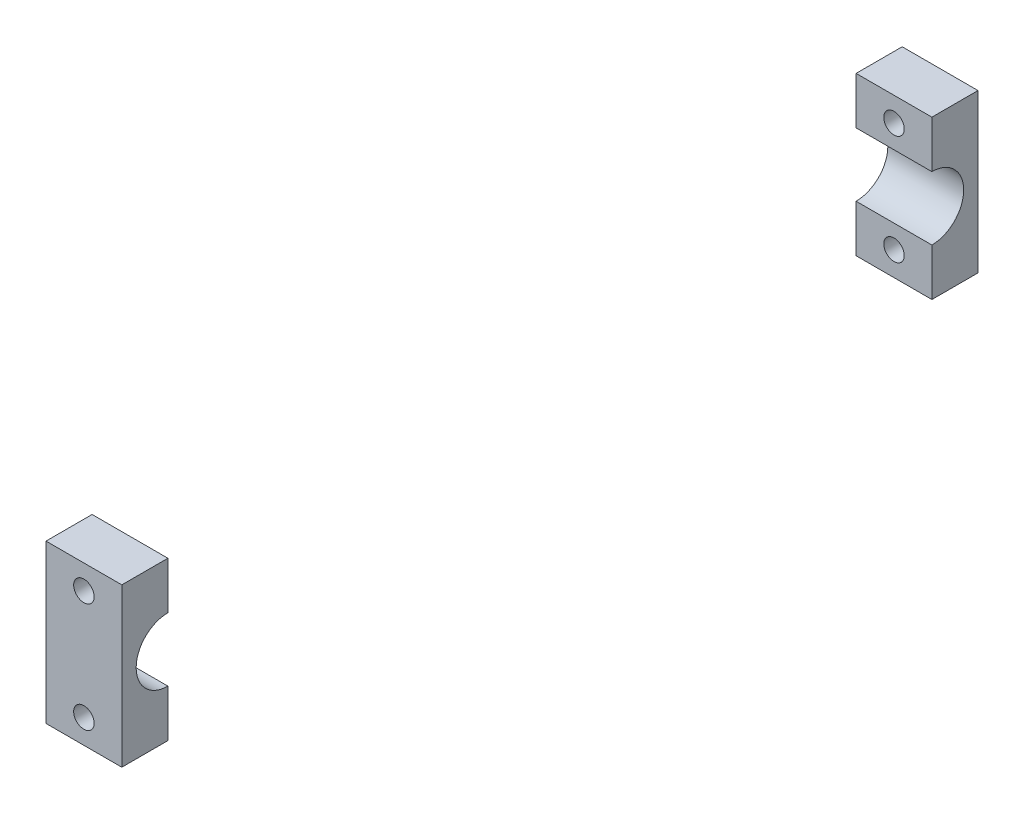
ISO-10303-21;
HEADER;
FILE_DESCRIPTION(('STEP AP214'),'2;1');
FILE_NAME('part.step','',(''),(''),'','','');
FILE_SCHEMA(('AUTOMOTIVE_DESIGN { 1 0 10303 214 1 1 1 1 }'));
ENDSEC;
DATA;
#1=APPLICATION_CONTEXT('core data for automotive mechanical design processes');
#2=APPLICATION_PROTOCOL_DEFINITION('international standard','automotive_design',2000,#1);
#3=PRODUCT_CONTEXT('',#1,'mechanical');
#4=PRODUCT('Part','Part','',(#3));
#5=PRODUCT_RELATED_PRODUCT_CATEGORY('part','',(#4));
#6=PRODUCT_DEFINITION_FORMATION('','',#4);
#7=PRODUCT_DEFINITION_CONTEXT('part definition',#1,'design');
#8=PRODUCT_DEFINITION('design','',#6,#7);
#9=PRODUCT_DEFINITION_SHAPE('','',#8);
#10=(LENGTH_UNIT() NAMED_UNIT(*) SI_UNIT(.MILLI.,.METRE.));
#11=(NAMED_UNIT(*) PLANE_ANGLE_UNIT() SI_UNIT($,.RADIAN.));
#12=(NAMED_UNIT(*) SI_UNIT($,.STERADIAN.) SOLID_ANGLE_UNIT());
#13=UNCERTAINTY_MEASURE_WITH_UNIT(LENGTH_MEASURE(1.E-05),#10,'distance_accuracy_value','');
#14=(GEOMETRIC_REPRESENTATION_CONTEXT(3) GLOBAL_UNCERTAINTY_ASSIGNED_CONTEXT((#13)) GLOBAL_UNIT_ASSIGNED_CONTEXT((#10,
#11,#12)) REPRESENTATION_CONTEXT('',''));
#15=CARTESIAN_POINT('',(0.,0.,0.));
#16=DIRECTION('',(0.,0.,1.));
#17=DIRECTION('',(1.,0.,0.));
#18=AXIS2_PLACEMENT_3D('',#15,#16,#17);
#19=CARTESIAN_POINT('',(14.8,0.,0.));
#20=DIRECTION('',(-1.,0.,0.));
#21=DIRECTION('',(0.,0.,1.));
#22=AXIS2_PLACEMENT_3D('',#19,#20,#21);
#23=PLANE('',#22);
#24=DIRECTION('',(0.,1.,0.));
#25=VECTOR('',#24,1.);
#26=CARTESIAN_POINT('',(14.8,-4.5,-83.579));
#27=LINE('',#26,#25);
#28=CARTESIAN_POINT('',(14.8,-54.92,-83.579));
#29=VERTEX_POINT('',#28);
#30=CARTESIAN_POINT('',(14.8,-24.08,-83.579));
#31=VERTEX_POINT('',#30);
#32=EDGE_CURVE('E144',#29,#31,#27,.T.);
#33=ORIENTED_EDGE('',*,*,#32,.T.);
#34=DIRECTION('',(0.,0.,1.));
#35=VECTOR('',#34,1.);
#36=CARTESIAN_POINT('',(14.8,-24.08,74.579));
#37=LINE('',#36,#35);
#38=CARTESIAN_POINT('',(14.8,-24.08,-74.579));
#39=VERTEX_POINT('',#38);
#40=EDGE_CURVE('E62',#31,#39,#37,.T.);
#41=ORIENTED_EDGE('',*,*,#40,.T.);
#42=DIRECTION('',(0.,-1.,0.));
#43=VECTOR('',#42,1.);
#44=CARTESIAN_POINT('',(14.8,-33.3,-74.579));
#45=LINE('',#44,#43);
#46=CARTESIAN_POINT('',(14.8,-33.3,-74.579));
#47=VERTEX_POINT('',#46);
#48=EDGE_CURVE('E124',#39,#47,#45,.T.);
#49=ORIENTED_EDGE('',*,*,#48,.T.);
#50=CARTESIAN_POINT('',(14.8,-39.5,-74.579));
#51=DIRECTION('',(-1.,0.,0.));
#52=DIRECTION('',(0.,0.,-1.));
#53=AXIS2_PLACEMENT_3D('',#50,#51,#52);
#54=CIRCLE('',#53,6.2);
#55=CARTESIAN_POINT('',(14.8,-45.7,-74.579));
#56=VERTEX_POINT('',#55);
#57=EDGE_CURVE('E147',#47,#56,#54,.T.);
#58=ORIENTED_EDGE('',*,*,#57,.T.);
#59=DIRECTION('',(0.,-1.,0.));
#60=VECTOR('',#59,1.);
#61=CARTESIAN_POINT('',(14.8,-54.92,-74.579));
#62=LINE('',#61,#60);
#63=CARTESIAN_POINT('',(14.8,-54.92,-74.579));
#64=VERTEX_POINT('',#63);
#65=EDGE_CURVE('E120',#56,#64,#62,.T.);
#66=ORIENTED_EDGE('',*,*,#65,.T.);
#67=DIRECTION('',(0.,0.,-1.));
#68=VECTOR('',#67,1.);
#69=CARTESIAN_POINT('',(14.8,-54.92,-83.579));
#70=LINE('',#69,#68);
#71=EDGE_CURVE('E114',#64,#29,#70,.T.);
#72=ORIENTED_EDGE('',*,*,#71,.T.);
#73=EDGE_LOOP('',(#33,#41,#49,#58,#66,#72));
#74=FACE_BOUND('',#73,.T.);
#75=ADVANCED_FACE('F46',(#74),#23,.F.);
#76=CARTESIAN_POINT('',(0.,0.,0.));
#77=DIRECTION('',(-1.,0.,0.));
#78=DIRECTION('',(0.,0.,1.));
#79=AXIS2_PLACEMENT_3D('',#76,#77,#78);
#80=PLANE('',#79);
#81=DIRECTION('',(0.,0.,1.));
#82=VECTOR('',#81,1.);
#83=CARTESIAN_POINT('',(0.,-24.08,74.579));
#84=LINE('',#83,#82);
#85=CARTESIAN_POINT('',(0.,-24.08,-83.5789999999999));
#86=VERTEX_POINT('',#85);
#87=CARTESIAN_POINT('',(0.,-24.08,-74.579));
#88=VERTEX_POINT('',#87);
#89=EDGE_CURVE('E50',#86,#88,#84,.T.);
#90=ORIENTED_EDGE('',*,*,#89,.F.);
#91=DIRECTION('',(0.,1.,0.));
#92=VECTOR('',#91,1.);
#93=CARTESIAN_POINT('',(0.,-39.5,-83.579));
#94=LINE('',#93,#92);
#95=CARTESIAN_POINT('',(0.,-54.92,-83.579));
#96=VERTEX_POINT('',#95);
#97=EDGE_CURVE('E105',#96,#86,#94,.T.);
#98=ORIENTED_EDGE('',*,*,#97,.F.);
#99=DIRECTION('',(0.,0.,-1.));
#100=VECTOR('',#99,1.);
#101=CARTESIAN_POINT('',(0.,-54.92,-83.579));
#102=LINE('',#101,#100);
#103=CARTESIAN_POINT('',(0.,-54.92,-74.579));
#104=VERTEX_POINT('',#103);
#105=EDGE_CURVE('E126',#104,#96,#102,.T.);
#106=ORIENTED_EDGE('',*,*,#105,.F.);
#107=DIRECTION('',(0.,-1.,0.));
#108=VECTOR('',#107,1.);
#109=CARTESIAN_POINT('',(0.,-54.92,-74.579));
#110=LINE('',#109,#108);
#111=CARTESIAN_POINT('',(0.,-45.7,-74.579));
#112=VERTEX_POINT('',#111);
#113=EDGE_CURVE('E128',#112,#104,#110,.T.);
#114=ORIENTED_EDGE('',*,*,#113,.F.);
#115=CARTESIAN_POINT('',(0.,-39.5,-74.579));
#116=DIRECTION('',(-1.,0.,0.));
#117=DIRECTION('',(0.,0.,-1.));
#118=AXIS2_PLACEMENT_3D('',#115,#116,#117);
#119=CIRCLE('',#118,6.2);
#120=CARTESIAN_POINT('',(0.,-33.3,-74.579));
#121=VERTEX_POINT('',#120);
#122=EDGE_CURVE('E133',#121,#112,#119,.T.);
#123=ORIENTED_EDGE('',*,*,#122,.F.);
#124=DIRECTION('',(0.,-1.,0.));
#125=VECTOR('',#124,1.);
#126=CARTESIAN_POINT('',(0.,-33.3,-74.579));
#127=LINE('',#126,#125);
#128=EDGE_CURVE('E108',#88,#121,#127,.T.);
#129=ORIENTED_EDGE('',*,*,#128,.F.);
#130=EDGE_LOOP('',(#90,#98,#106,#114,#123,#129));
#131=FACE_BOUND('',#130,.T.);
#132=ADVANCED_FACE('F103',(#131),#80,.T.);
#133=CARTESIAN_POINT('',(0.,-4.5,-83.579));
#134=DIRECTION('',(0.,0.,-1.));
#135=DIRECTION('',(0.,1.,0.));
#136=AXIS2_PLACEMENT_3D('',#133,#134,#135);
#137=PLANE('',#136);
#138=DIRECTION('',(-1.,0.,0.));
#139=VECTOR('',#138,1.);
#140=CARTESIAN_POINT('',(0.,-24.08,-83.579));
#141=LINE('',#140,#139);
#142=EDGE_CURVE('E94',#31,#86,#141,.T.);
#143=ORIENTED_EDGE('',*,*,#142,.F.);
#144=ORIENTED_EDGE('',*,*,#32,.F.);
#145=DIRECTION('',(1.,0.,0.));
#146=VECTOR('',#145,1.);
#147=CARTESIAN_POINT('',(0.,-54.92,-83.579));
#148=LINE('',#147,#146);
#149=EDGE_CURVE('E112',#96,#29,#148,.T.);
#150=ORIENTED_EDGE('',*,*,#149,.F.);
#151=ORIENTED_EDGE('',*,*,#97,.T.);
#152=EDGE_LOOP('',(#143,#144,#150,#151));
#153=FACE_BOUND('',#152,.T.);
#154=CARTESIAN_POINT('',(7.4,-28.8,-83.579));
#155=DIRECTION('',(0.,0.,-1.));
#156=DIRECTION('',(0.,1.,0.));
#157=AXIS2_PLACEMENT_3D('',#154,#155,#156);
#158=CIRCLE('',#157,2.);
#159=CARTESIAN_POINT('',(7.4,-26.8,-83.579));
#160=VERTEX_POINT('',#159);
#161=EDGE_CURVE('E113',#160,#160,#158,.F.);
#162=ORIENTED_EDGE('',*,*,#161,.T.);
#163=EDGE_LOOP('',(#162));
#164=FACE_BOUND('',#163,.T.);
#165=CARTESIAN_POINT('',(7.4,-50.2,-83.579));
#166=DIRECTION('',(0.,0.,-1.));
#167=DIRECTION('',(0.,1.,0.));
#168=AXIS2_PLACEMENT_3D('',#165,#166,#167);
#169=CIRCLE('',#168,2.);
#170=CARTESIAN_POINT('',(7.4,-48.2,-83.579));
#171=VERTEX_POINT('',#170);
#172=EDGE_CURVE('E117',#171,#171,#169,.F.);
#173=ORIENTED_EDGE('',*,*,#172,.T.);
#174=EDGE_LOOP('',(#173));
#175=FACE_BOUND('',#174,.T.);
#176=ADVANCED_FACE('F109',(#153,#164,#175),#137,.T.);
#177=CARTESIAN_POINT('',(0.,-54.92,-83.579));
#178=DIRECTION('',(0.,-1.,0.));
#179=DIRECTION('',(0.,0.,-1.));
#180=AXIS2_PLACEMENT_3D('',#177,#178,#179);
#181=PLANE('',#180);
#182=ORIENTED_EDGE('',*,*,#71,.F.);
#183=DIRECTION('',(1.,0.,0.));
#184=VECTOR('',#183,1.);
#185=CARTESIAN_POINT('',(0.,-54.92,-74.579));
#186=LINE('',#185,#184);
#187=EDGE_CURVE('E131',#104,#64,#186,.T.);
#188=ORIENTED_EDGE('',*,*,#187,.F.);
#189=ORIENTED_EDGE('',*,*,#105,.T.);
#190=ORIENTED_EDGE('',*,*,#149,.T.);
#191=EDGE_LOOP('',(#182,#188,#189,#190));
#192=FACE_BOUND('',#191,.T.);
#193=ADVANCED_FACE('F166',(#192),#181,.T.);
#194=CARTESIAN_POINT('',(0.,-54.92,-74.579));
#195=DIRECTION('',(0.,0.,1.));
#196=DIRECTION('',(1.,0.,0.));
#197=AXIS2_PLACEMENT_3D('',#194,#195,#196);
#198=PLANE('',#197);
#199=CARTESIAN_POINT('',(7.4,-50.2,-74.579));
#200=DIRECTION('',(0.,0.,1.));
#201=DIRECTION('',(1.,0.,0.));
#202=AXIS2_PLACEMENT_3D('',#199,#200,#201);
#203=CIRCLE('',#202,2.);
#204=CARTESIAN_POINT('',(9.4,-50.2,-74.579));
#205=VERTEX_POINT('',#204);
#206=EDGE_CURVE('E132',#205,#205,#203,.F.);
#207=ORIENTED_EDGE('',*,*,#206,.T.);
#208=EDGE_LOOP('',(#207));
#209=FACE_BOUND('',#208,.T.);
#210=ORIENTED_EDGE('',*,*,#65,.F.);
#211=DIRECTION('',(1.,0.,0.));
#212=VECTOR('',#211,1.);
#213=CARTESIAN_POINT('',(0.,-45.7,-74.579));
#214=LINE('',#213,#212);
#215=EDGE_CURVE('E136',#112,#56,#214,.T.);
#216=ORIENTED_EDGE('',*,*,#215,.F.);
#217=ORIENTED_EDGE('',*,*,#113,.T.);
#218=ORIENTED_EDGE('',*,*,#187,.T.);
#219=EDGE_LOOP('',(#210,#216,#217,#218));
#220=FACE_BOUND('',#219,.T.);
#221=ADVANCED_FACE('F163',(#209,#220),#198,.T.);
#222=CARTESIAN_POINT('',(0.,-39.5,-74.579));
#223=DIRECTION('',(1.,0.,0.));
#224=DIRECTION('',(0.,0.,-1.));
#225=AXIS2_PLACEMENT_3D('',#222,#223,#224);
#226=CYLINDRICAL_SURFACE('',#225,6.2);
#227=ORIENTED_EDGE('',*,*,#57,.F.);
#228=DIRECTION('',(1.,0.,0.));
#229=VECTOR('',#228,1.);
#230=CARTESIAN_POINT('',(0.,-33.3,-74.579));
#231=LINE('',#230,#229);
#232=EDGE_CURVE('E137',#121,#47,#231,.T.);
#233=ORIENTED_EDGE('',*,*,#232,.F.);
#234=ORIENTED_EDGE('',*,*,#122,.T.);
#235=ORIENTED_EDGE('',*,*,#215,.T.);
#236=EDGE_LOOP('',(#227,#233,#234,#235));
#237=FACE_BOUND('',#236,.T.);
#238=ADVANCED_FACE('F159',(#237),#226,.F.);
#239=CARTESIAN_POINT('',(0.,-33.3,-74.579));
#240=DIRECTION('',(0.,0.,1.));
#241=DIRECTION('',(1.,0.,0.));
#242=AXIS2_PLACEMENT_3D('',#239,#240,#241);
#243=PLANE('',#242);
#244=DIRECTION('',(1.,0.,0.));
#245=VECTOR('',#244,1.);
#246=CARTESIAN_POINT('',(0.,-24.08,-74.579));
#247=LINE('',#246,#245);
#248=EDGE_CURVE('E12',#88,#39,#247,.T.);
#249=ORIENTED_EDGE('',*,*,#248,.F.);
#250=ORIENTED_EDGE('',*,*,#128,.T.);
#251=ORIENTED_EDGE('',*,*,#232,.T.);
#252=ORIENTED_EDGE('',*,*,#48,.F.);
#253=EDGE_LOOP('',(#249,#250,#251,#252));
#254=FACE_BOUND('',#253,.T.);
#255=CARTESIAN_POINT('',(7.4,-28.8,-74.579));
#256=DIRECTION('',(0.,0.,1.));
#257=DIRECTION('',(1.,0.,0.));
#258=AXIS2_PLACEMENT_3D('',#255,#256,#257);
#259=CIRCLE('',#258,2.);
#260=CARTESIAN_POINT('',(9.4,-28.8,-74.579));
#261=VERTEX_POINT('',#260);
#262=EDGE_CURVE('E98',#261,#261,#259,.F.);
#263=ORIENTED_EDGE('',*,*,#262,.T.);
#264=EDGE_LOOP('',(#263));
#265=FACE_BOUND('',#264,.T.);
#266=ADVANCED_FACE('F186',(#254,#265),#243,.T.);
#267=CARTESIAN_POINT('',(7.4,-28.8,-90.));
#268=DIRECTION('',(0.,0.,1.));
#269=DIRECTION('',(1.,0.,0.));
#270=AXIS2_PLACEMENT_3D('',#267,#268,#269);
#271=CYLINDRICAL_SURFACE('',#270,2.);
#272=ORIENTED_EDGE('',*,*,#161,.F.);
#273=EDGE_LOOP('',(#272));
#274=FACE_BOUND('',#273,.T.);
#275=ORIENTED_EDGE('',*,*,#262,.F.);
#276=EDGE_LOOP('',(#275));
#277=FACE_BOUND('',#276,.T.);
#278=ADVANCED_FACE('F182',(#274,#277),#271,.F.);
#279=CARTESIAN_POINT('',(7.4,-50.2,-90.));
#280=DIRECTION('',(0.,0.,1.));
#281=DIRECTION('',(1.,0.,0.));
#282=AXIS2_PLACEMENT_3D('',#279,#280,#281);
#283=CYLINDRICAL_SURFACE('',#282,2.);
#284=ORIENTED_EDGE('',*,*,#172,.F.);
#285=EDGE_LOOP('',(#284));
#286=FACE_BOUND('',#285,.T.);
#287=ORIENTED_EDGE('',*,*,#206,.F.);
#288=EDGE_LOOP('',(#287));
#289=FACE_BOUND('',#288,.T.);
#290=ADVANCED_FACE('F185',(#286,#289),#283,.F.);
#291=CARTESIAN_POINT('',(14.8,-24.08,74.579));
#292=DIRECTION('',(0.,-1.,0.));
#293=DIRECTION('',(0.,0.,-1.));
#294=AXIS2_PLACEMENT_3D('',#291,#292,#293);
#295=PLANE('',#294);
#296=ORIENTED_EDGE('',*,*,#142,.T.);
#297=ORIENTED_EDGE('',*,*,#89,.T.);
#298=ORIENTED_EDGE('',*,*,#248,.T.);
#299=ORIENTED_EDGE('',*,*,#40,.F.);
#300=EDGE_LOOP('',(#296,#297,#298,#299));
#301=FACE_BOUND('',#300,.T.);
#302=ADVANCED_FACE('F48',(#301),#295,.F.);
#303=CLOSED_SHELL('',(#75,#132,#176,#193,#221,#238,#266,#278,#290,#302));
#304=MANIFOLD_SOLID_BREP('B2',#303);
#305=CARTESIAN_POINT('',(0.,-54.92,74.579));
#306=DIRECTION('',(0.,0.,-1.));
#307=DIRECTION('',(-1.,0.,0.));
#308=AXIS2_PLACEMENT_3D('',#305,#306,#307);
#309=PLANE('',#308);
#310=CARTESIAN_POINT('',(7.4,-50.2,74.579));
#311=DIRECTION('',(0.,0.,-1.));
#312=DIRECTION('',(-1.,0.,0.));
#313=AXIS2_PLACEMENT_3D('',#310,#311,#312);
#314=CIRCLE('',#313,2.);
#315=CARTESIAN_POINT('',(5.4,-50.2,74.579));
#316=VERTEX_POINT('',#315);
#317=EDGE_CURVE('E384',#316,#316,#314,.F.);
#318=ORIENTED_EDGE('',*,*,#317,.T.);
#319=EDGE_LOOP('',(#318));
#320=FACE_BOUND('',#319,.T.);
#321=DIRECTION('',(0.,1.,0.));
#322=VECTOR('',#321,1.);
#323=CARTESIAN_POINT('',(14.8,-54.92,74.579));
#324=LINE('',#323,#322);
#325=CARTESIAN_POINT('',(14.8,-54.92,74.579));
#326=VERTEX_POINT('',#325);
#327=CARTESIAN_POINT('',(14.8,-45.7,74.579));
#328=VERTEX_POINT('',#327);
#329=EDGE_CURVE('E368',#326,#328,#324,.T.);
#330=ORIENTED_EDGE('',*,*,#329,.F.);
#331=DIRECTION('',(1.,0.,0.));
#332=VECTOR('',#331,1.);
#333=CARTESIAN_POINT('',(0.,-54.92,74.579));
#334=LINE('',#333,#332);
#335=CARTESIAN_POINT('',(0.,-54.92,74.579));
#336=VERTEX_POINT('',#335);
#337=EDGE_CURVE('E333',#336,#326,#334,.T.);
#338=ORIENTED_EDGE('',*,*,#337,.F.);
#339=DIRECTION('',(0.,1.,0.));
#340=VECTOR('',#339,1.);
#341=CARTESIAN_POINT('',(0.,-54.92,74.579));
#342=LINE('',#341,#340);
#343=CARTESIAN_POINT('',(0.,-45.7,74.579));
#344=VERTEX_POINT('',#343);
#345=EDGE_CURVE('E362',#336,#344,#342,.T.);
#346=ORIENTED_EDGE('',*,*,#345,.T.);
#347=DIRECTION('',(1.,0.,0.));
#348=VECTOR('',#347,1.);
#349=CARTESIAN_POINT('',(0.,-45.7,74.579));
#350=LINE('',#349,#348);
#351=EDGE_CURVE('E381',#344,#328,#350,.T.);
#352=ORIENTED_EDGE('',*,*,#351,.T.);
#353=EDGE_LOOP('',(#330,#338,#346,#352));
#354=FACE_BOUND('',#353,.T.);
#355=ADVANCED_FACE('F282',(#320,#354),#309,.T.);
#356=CARTESIAN_POINT('',(7.4,-50.2,-90.));
#357=DIRECTION('',(0.,0.,1.));
#358=DIRECTION('',(1.,0.,0.));
#359=AXIS2_PLACEMENT_3D('',#356,#357,#358);
#360=CYLINDRICAL_SURFACE('',#359,2.);
#361=CARTESIAN_POINT('',(7.4,-50.2,83.579));
#362=DIRECTION('',(0.,0.,1.));
#363=DIRECTION('',(1.,0.,0.));
#364=AXIS2_PLACEMENT_3D('',#361,#362,#363);
#365=CIRCLE('',#364,2.);
#366=CARTESIAN_POINT('',(9.4,-50.2,83.579));
#367=VERTEX_POINT('',#366);
#368=EDGE_CURVE('E386',#367,#367,#365,.F.);
#369=ORIENTED_EDGE('',*,*,#368,.F.);
#370=EDGE_LOOP('',(#369));
#371=FACE_BOUND('',#370,.T.);
#372=ORIENTED_EDGE('',*,*,#317,.F.);
#373=EDGE_LOOP('',(#372));
#374=FACE_BOUND('',#373,.T.);
#375=ADVANCED_FACE('F423',(#371,#374),#360,.F.);
#376=CARTESIAN_POINT('',(0.,-54.92,83.579));
#377=DIRECTION('',(0.,-1.,0.));
#378=DIRECTION('',(0.,0.,-1.));
#379=AXIS2_PLACEMENT_3D('',#376,#377,#378);
#380=PLANE('',#379);
#381=DIRECTION('',(0.,0.,-1.));
#382=VECTOR('',#381,1.);
#383=CARTESIAN_POINT('',(14.8,-54.92,83.579));
#384=LINE('',#383,#382);
#385=CARTESIAN_POINT('',(14.8,-54.92,83.579));
#386=VERTEX_POINT('',#385);
#387=EDGE_CURVE('E366',#386,#326,#384,.T.);
#388=ORIENTED_EDGE('',*,*,#387,.F.);
#389=DIRECTION('',(1.,0.,0.));
#390=VECTOR('',#389,1.);
#391=CARTESIAN_POINT('',(0.,-54.92,83.579));
#392=LINE('',#391,#390);
#393=CARTESIAN_POINT('',(0.,-54.92,83.579));
#394=VERTEX_POINT('',#393);
#395=EDGE_CURVE('E290',#394,#386,#392,.T.);
#396=ORIENTED_EDGE('',*,*,#395,.F.);
#397=DIRECTION('',(0.,0.,-1.));
#398=VECTOR('',#397,1.);
#399=CARTESIAN_POINT('',(0.,-54.92,83.579));
#400=LINE('',#399,#398);
#401=EDGE_CURVE('E378',#394,#336,#400,.T.);
#402=ORIENTED_EDGE('',*,*,#401,.T.);
#403=ORIENTED_EDGE('',*,*,#337,.T.);
#404=EDGE_LOOP('',(#388,#396,#402,#403));
#405=FACE_BOUND('',#404,.T.);
#406=ADVANCED_FACE('F403',(#405),#380,.T.);
#407=CARTESIAN_POINT('',(7.4,-28.8,-90.));
#408=DIRECTION('',(0.,0.,1.));
#409=DIRECTION('',(1.,0.,0.));
#410=AXIS2_PLACEMENT_3D('',#407,#408,#409);
#411=CYLINDRICAL_SURFACE('',#410,2.);
#412=CARTESIAN_POINT('',(7.4,-28.8,83.579));
#413=DIRECTION('',(0.,0.,1.));
#414=DIRECTION('',(1.,0.,0.));
#415=AXIS2_PLACEMENT_3D('',#412,#413,#414);
#416=CIRCLE('',#415,2.);
#417=CARTESIAN_POINT('',(9.4,-28.8,83.579));
#418=VERTEX_POINT('',#417);
#419=EDGE_CURVE('E369',#418,#418,#416,.F.);
#420=ORIENTED_EDGE('',*,*,#419,.F.);
#421=EDGE_LOOP('',(#420));
#422=FACE_BOUND('',#421,.T.);
#423=CARTESIAN_POINT('',(7.4,-28.8,74.579));
#424=DIRECTION('',(0.,0.,-1.));
#425=DIRECTION('',(-1.,0.,0.));
#426=AXIS2_PLACEMENT_3D('',#423,#424,#425);
#427=CIRCLE('',#426,2.);
#428=CARTESIAN_POINT('',(5.4,-28.8,74.579));
#429=VERTEX_POINT('',#428);
#430=EDGE_CURVE('E388',#429,#429,#427,.F.);
#431=ORIENTED_EDGE('',*,*,#430,.F.);
#432=EDGE_LOOP('',(#431));
#433=FACE_BOUND('',#432,.T.);
#434=ADVANCED_FACE('F411',(#422,#433),#411,.F.);
#435=CARTESIAN_POINT('',(0.,-39.5,74.579));
#436=DIRECTION('',(1.,0.,0.));
#437=DIRECTION('',(0.,0.,-1.));
#438=AXIS2_PLACEMENT_3D('',#435,#436,#437);
#439=CYLINDRICAL_SURFACE('',#438,6.2);
#440=CARTESIAN_POINT('',(14.8,-39.5,74.579));
#441=DIRECTION('',(-1.,0.,0.));
#442=DIRECTION('',(0.,0.,1.));
#443=AXIS2_PLACEMENT_3D('',#440,#441,#442);
#444=CIRCLE('',#443,6.2);
#445=CARTESIAN_POINT('',(14.8,-33.3,74.579));
#446=VERTEX_POINT('',#445);
#447=EDGE_CURVE('E372',#328,#446,#444,.T.);
#448=ORIENTED_EDGE('',*,*,#447,.F.);
#449=ORIENTED_EDGE('',*,*,#351,.F.);
#450=CARTESIAN_POINT('',(0.,-39.5,74.579));
#451=DIRECTION('',(-1.,0.,0.));
#452=DIRECTION('',(0.,0.,1.));
#453=AXIS2_PLACEMENT_3D('',#450,#451,#452);
#454=CIRCLE('',#453,6.2);
#455=CARTESIAN_POINT('',(0.,-33.3,74.579));
#456=VERTEX_POINT('',#455);
#457=EDGE_CURVE('E359',#344,#456,#454,.T.);
#458=ORIENTED_EDGE('',*,*,#457,.T.);
#459=DIRECTION('',(1.,0.,0.));
#460=VECTOR('',#459,1.);
#461=CARTESIAN_POINT('',(0.,-33.3,74.579));
#462=LINE('',#461,#460);
#463=EDGE_CURVE('E358',#456,#446,#462,.T.);
#464=ORIENTED_EDGE('',*,*,#463,.T.);
#465=EDGE_LOOP('',(#448,#449,#458,#464));
#466=FACE_BOUND('',#465,.T.);
#467=ADVANCED_FACE('F409',(#466),#439,.F.);
#468=CARTESIAN_POINT('',(0.,-39.5,83.579));
#469=DIRECTION('',(0.,0.,1.));
#470=DIRECTION('',(1.,0.,0.));
#471=AXIS2_PLACEMENT_3D('',#468,#469,#470);
#472=PLANE('',#471);
#473=DIRECTION('',(1.,0.,0.));
#474=VECTOR('',#473,1.);
#475=CARTESIAN_POINT('',(0.,-24.08,83.579));
#476=LINE('',#475,#474);
#477=CARTESIAN_POINT('',(0.,-24.08,83.579));
#478=VERTEX_POINT('',#477);
#479=CARTESIAN_POINT('',(14.8,-24.08,83.579));
#480=VERTEX_POINT('',#479);
#481=EDGE_CURVE('E387',#478,#480,#476,.T.);
#482=ORIENTED_EDGE('',*,*,#481,.F.);
#483=DIRECTION('',(0.,-1.,0.));
#484=VECTOR('',#483,1.);
#485=CARTESIAN_POINT('',(0.,-4.5,83.579));
#486=LINE('',#485,#484);
#487=EDGE_CURVE('E305',#478,#394,#486,.T.);
#488=ORIENTED_EDGE('',*,*,#487,.T.);
#489=ORIENTED_EDGE('',*,*,#395,.T.);
#490=DIRECTION('',(0.,-1.,0.));
#491=VECTOR('',#490,1.);
#492=CARTESIAN_POINT('',(14.8,-39.5,83.579));
#493=LINE('',#492,#491);
#494=EDGE_CURVE('E327',#480,#386,#493,.T.);
#495=ORIENTED_EDGE('',*,*,#494,.F.);
#496=EDGE_LOOP('',(#482,#488,#489,#495));
#497=FACE_BOUND('',#496,.T.);
#498=ORIENTED_EDGE('',*,*,#419,.T.);
#499=EDGE_LOOP('',(#498));
#500=FACE_BOUND('',#499,.T.);
#501=ORIENTED_EDGE('',*,*,#368,.T.);
#502=EDGE_LOOP('',(#501));
#503=FACE_BOUND('',#502,.T.);
#504=ADVANCED_FACE('F404',(#497,#500,#503),#472,.T.);
#505=CARTESIAN_POINT('',(0.,-33.3,74.579));
#506=DIRECTION('',(0.,0.,-1.));
#507=DIRECTION('',(-1.,0.,0.));
#508=AXIS2_PLACEMENT_3D('',#505,#506,#507);
#509=PLANE('',#508);
#510=DIRECTION('',(-1.,0.,0.));
#511=VECTOR('',#510,1.);
#512=CARTESIAN_POINT('',(0.,-24.08,74.579));
#513=LINE('',#512,#511);
#514=CARTESIAN_POINT('',(14.8,-24.08,74.579));
#515=VERTEX_POINT('',#514);
#516=CARTESIAN_POINT('',(0.,-24.08,74.579));
#517=VERTEX_POINT('',#516);
#518=EDGE_CURVE('E44',#515,#517,#513,.T.);
#519=ORIENTED_EDGE('',*,*,#518,.F.);
#520=DIRECTION('',(0.,1.,0.));
#521=VECTOR('',#520,1.);
#522=CARTESIAN_POINT('',(14.8,-33.3,74.579));
#523=LINE('',#522,#521);
#524=EDGE_CURVE('E375',#446,#515,#523,.T.);
#525=ORIENTED_EDGE('',*,*,#524,.F.);
#526=ORIENTED_EDGE('',*,*,#463,.F.);
#527=DIRECTION('',(0.,1.,0.));
#528=VECTOR('',#527,1.);
#529=CARTESIAN_POINT('',(0.,-33.3,74.579));
#530=LINE('',#529,#528);
#531=EDGE_CURVE('E352',#456,#517,#530,.T.);
#532=ORIENTED_EDGE('',*,*,#531,.T.);
#533=EDGE_LOOP('',(#519,#525,#526,#532));
#534=FACE_BOUND('',#533,.T.);
#535=ORIENTED_EDGE('',*,*,#430,.T.);
#536=EDGE_LOOP('',(#535));
#537=FACE_BOUND('',#536,.T.);
#538=ADVANCED_FACE('F356',(#534,#537),#509,.T.);
#539=CARTESIAN_POINT('',(0.,0.,0.));
#540=DIRECTION('',(-1.,0.,0.));
#541=DIRECTION('',(0.,0.,1.));
#542=AXIS2_PLACEMENT_3D('',#539,#540,#541);
#543=PLANE('',#542);
#544=DIRECTION('',(0.,0.,1.));
#545=VECTOR('',#544,1.);
#546=CARTESIAN_POINT('',(0.,-24.08,74.579));
#547=LINE('',#546,#545);
#548=EDGE_CURVE('E344',#517,#478,#547,.T.);
#549=ORIENTED_EDGE('',*,*,#548,.F.);
#550=ORIENTED_EDGE('',*,*,#531,.F.);
#551=ORIENTED_EDGE('',*,*,#457,.F.);
#552=ORIENTED_EDGE('',*,*,#345,.F.);
#553=ORIENTED_EDGE('',*,*,#401,.F.);
#554=ORIENTED_EDGE('',*,*,#487,.F.);
#555=EDGE_LOOP('',(#549,#550,#551,#552,#553,#554));
#556=FACE_BOUND('',#555,.T.);
#557=ADVANCED_FACE('F284',(#556),#543,.T.);
#558=CARTESIAN_POINT('',(14.8,0.,0.));
#559=DIRECTION('',(-1.,0.,0.));
#560=DIRECTION('',(0.,0.,1.));
#561=AXIS2_PLACEMENT_3D('',#558,#559,#560);
#562=PLANE('',#561);
#563=ORIENTED_EDGE('',*,*,#524,.T.);
#564=DIRECTION('',(0.,0.,1.));
#565=VECTOR('',#564,1.);
#566=CARTESIAN_POINT('',(14.8,-24.08,74.579));
#567=LINE('',#566,#565);
#568=EDGE_CURVE('E296',#515,#480,#567,.T.);
#569=ORIENTED_EDGE('',*,*,#568,.T.);
#570=ORIENTED_EDGE('',*,*,#494,.T.);
#571=ORIENTED_EDGE('',*,*,#387,.T.);
#572=ORIENTED_EDGE('',*,*,#329,.T.);
#573=ORIENTED_EDGE('',*,*,#447,.T.);
#574=EDGE_LOOP('',(#563,#569,#570,#571,#572,#573));
#575=FACE_BOUND('',#574,.T.);
#576=ADVANCED_FACE('F407',(#575),#562,.F.);
#577=CARTESIAN_POINT('',(14.8,-24.08,74.579));
#578=DIRECTION('',(0.,-1.,0.));
#579=DIRECTION('',(0.,0.,-1.));
#580=AXIS2_PLACEMENT_3D('',#577,#578,#579);
#581=PLANE('',#580);
#582=ORIENTED_EDGE('',*,*,#481,.T.);
#583=ORIENTED_EDGE('',*,*,#568,.F.);
#584=ORIENTED_EDGE('',*,*,#518,.T.);
#585=ORIENTED_EDGE('',*,*,#548,.T.);
#586=EDGE_LOOP('',(#582,#583,#584,#585));
#587=FACE_BOUND('',#586,.T.);
#588=ADVANCED_FACE('F343',(#587),#581,.F.);
#589=CLOSED_SHELL('',(#355,#375,#406,#434,#467,#504,#538,#557,#576,#588));
#590=MANIFOLD_SOLID_BREP('B6',#589);
#591=ADVANCED_BREP_SHAPE_REPRESENTATION('',(#18,#304,#590),#14);
#592=SHAPE_DEFINITION_REPRESENTATION(#9,#591);
ENDSEC;
END-ISO-10303-21;
